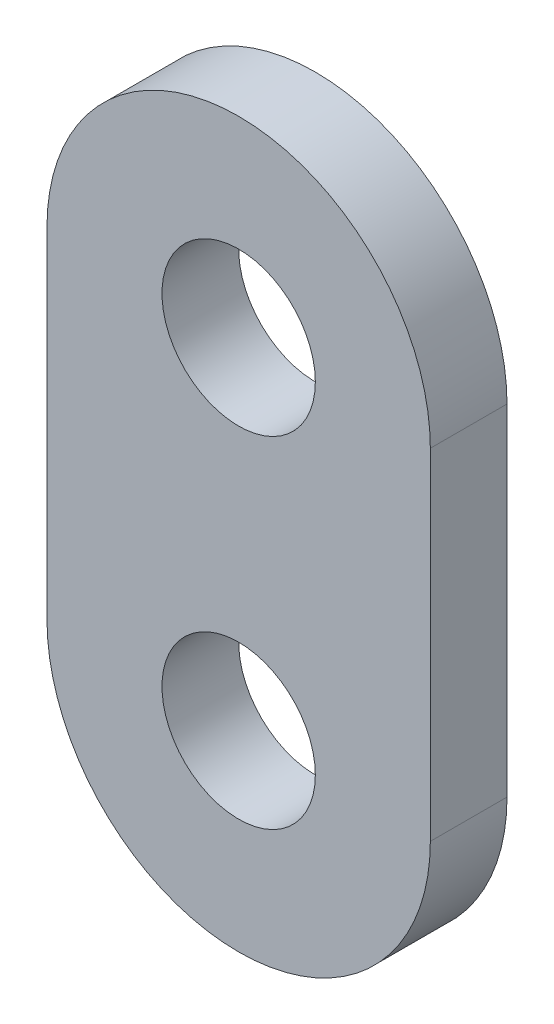
ISO-10303-21;
HEADER;
FILE_DESCRIPTION(('STEP AP214'),'2;1');
FILE_NAME('part.step','',(''),(''),'','','');
FILE_SCHEMA(('AUTOMOTIVE_DESIGN { 1 0 10303 214 1 1 1 1 }'));
ENDSEC;
DATA;
#1=APPLICATION_CONTEXT('core data for automotive mechanical design processes');
#2=APPLICATION_PROTOCOL_DEFINITION('international standard','automotive_design',2000,#1);
#3=PRODUCT_CONTEXT('',#1,'mechanical');
#4=PRODUCT('Part','Part','',(#3));
#5=PRODUCT_RELATED_PRODUCT_CATEGORY('part','',(#4));
#6=PRODUCT_DEFINITION_FORMATION('','',#4);
#7=PRODUCT_DEFINITION_CONTEXT('part definition',#1,'design');
#8=PRODUCT_DEFINITION('design','',#6,#7);
#9=PRODUCT_DEFINITION_SHAPE('','',#8);
#10=(LENGTH_UNIT() NAMED_UNIT(*) SI_UNIT(.MILLI.,.METRE.));
#11=(NAMED_UNIT(*) PLANE_ANGLE_UNIT() SI_UNIT($,.RADIAN.));
#12=(NAMED_UNIT(*) SI_UNIT($,.STERADIAN.) SOLID_ANGLE_UNIT());
#13=UNCERTAINTY_MEASURE_WITH_UNIT(LENGTH_MEASURE(1.E-05),#10,'distance_accuracy_value','');
#14=(GEOMETRIC_REPRESENTATION_CONTEXT(3) GLOBAL_UNCERTAINTY_ASSIGNED_CONTEXT((#13)) GLOBAL_UNIT_ASSIGNED_CONTEXT((#10,
#11,#12)) REPRESENTATION_CONTEXT('',''));
#15=CARTESIAN_POINT('',(0.,0.,0.));
#16=DIRECTION('',(0.,0.,1.));
#17=DIRECTION('',(1.,0.,0.));
#18=AXIS2_PLACEMENT_3D('',#15,#16,#17);
#19=CARTESIAN_POINT('',(25.,0.,10.));
#20=DIRECTION('',(0.,0.,1.));
#21=DIRECTION('',(1.,0.,0.));
#22=AXIS2_PLACEMENT_3D('',#19,#20,#21);
#23=PLANE('',#22);
#24=CARTESIAN_POINT('',(25.,44.4,10.));
#25=DIRECTION('',(0.,0.,1.));
#26=DIRECTION('',(1.,0.,0.));
#27=AXIS2_PLACEMENT_3D('',#24,#25,#26);
#28=CIRCLE('',#27,10.);
#29=CARTESIAN_POINT('',(35.,44.4,10.));
#30=VERTEX_POINT('',#29);
#31=EDGE_CURVE('E100',#30,#30,#28,.T.);
#32=ORIENTED_EDGE('',*,*,#31,.F.);
#33=EDGE_LOOP('',(#32));
#34=FACE_BOUND('',#33,.T.);
#35=CARTESIAN_POINT('',(25.,0.,10.));
#36=DIRECTION('',(0.,0.,1.));
#37=DIRECTION('',(1.,0.,0.));
#38=AXIS2_PLACEMENT_3D('',#35,#36,#37);
#39=CIRCLE('',#38,25.);
#40=CARTESIAN_POINT('',(0.,0.,10.));
#41=VERTEX_POINT('',#40);
#42=CARTESIAN_POINT('',(50.,0.,10.));
#43=VERTEX_POINT('',#42);
#44=EDGE_CURVE('E85',#41,#43,#39,.T.);
#45=ORIENTED_EDGE('',*,*,#44,.T.);
#46=DIRECTION('',(0.,1.,0.));
#47=VECTOR('',#46,1.);
#48=CARTESIAN_POINT('',(50.,0.,10.));
#49=LINE('',#48,#47);
#50=CARTESIAN_POINT('',(50.,44.4,10.));
#51=VERTEX_POINT('',#50);
#52=EDGE_CURVE('E80',#43,#51,#49,.T.);
#53=ORIENTED_EDGE('',*,*,#52,.T.);
#54=CARTESIAN_POINT('',(25.,44.4,10.));
#55=DIRECTION('',(0.,0.,1.));
#56=DIRECTION('',(1.,0.,0.));
#57=AXIS2_PLACEMENT_3D('',#54,#55,#56);
#58=CIRCLE('',#57,25.);
#59=CARTESIAN_POINT('',(0.,44.4,10.));
#60=VERTEX_POINT('',#59);
#61=EDGE_CURVE('E83',#51,#60,#58,.T.);
#62=ORIENTED_EDGE('',*,*,#61,.T.);
#63=DIRECTION('',(0.,-1.,0.));
#64=VECTOR('',#63,1.);
#65=CARTESIAN_POINT('',(0.,44.4,10.));
#66=LINE('',#65,#64);
#67=EDGE_CURVE('E50',#60,#41,#66,.T.);
#68=ORIENTED_EDGE('',*,*,#67,.T.);
#69=EDGE_LOOP('',(#45,#53,#62,#68));
#70=FACE_BOUND('',#69,.T.);
#71=CARTESIAN_POINT('',(25.,0.,10.));
#72=DIRECTION('',(0.,0.,1.));
#73=DIRECTION('',(1.,0.,0.));
#74=AXIS2_PLACEMENT_3D('',#71,#72,#73);
#75=CIRCLE('',#74,10.);
#76=CARTESIAN_POINT('',(35.,0.,10.));
#77=VERTEX_POINT('',#76);
#78=EDGE_CURVE('E115',#77,#77,#75,.T.);
#79=ORIENTED_EDGE('',*,*,#78,.F.);
#80=EDGE_LOOP('',(#79));
#81=FACE_BOUND('',#80,.T.);
#82=ADVANCED_FACE('F33',(#34,#70,#81),#23,.T.);
#83=CARTESIAN_POINT('',(25.,0.,0.));
#84=DIRECTION('',(0.,0.,1.));
#85=DIRECTION('',(1.,0.,0.));
#86=AXIS2_PLACEMENT_3D('',#83,#84,#85);
#87=PLANE('',#86);
#88=CARTESIAN_POINT('',(25.,44.4,0.));
#89=DIRECTION('',(0.,0.,1.));
#90=DIRECTION('',(1.,0.,0.));
#91=AXIS2_PLACEMENT_3D('',#88,#89,#90);
#92=CIRCLE('',#91,10.);
#93=CARTESIAN_POINT('',(35.,44.4,0.));
#94=VERTEX_POINT('',#93);
#95=EDGE_CURVE('E112',#94,#94,#92,.T.);
#96=ORIENTED_EDGE('',*,*,#95,.T.);
#97=EDGE_LOOP('',(#96));
#98=FACE_BOUND('',#97,.T.);
#99=CARTESIAN_POINT('',(25.,0.,0.));
#100=DIRECTION('',(0.,0.,1.));
#101=DIRECTION('',(1.,0.,0.));
#102=AXIS2_PLACEMENT_3D('',#99,#100,#101);
#103=CIRCLE('',#102,25.);
#104=CARTESIAN_POINT('',(0.,0.,0.));
#105=VERTEX_POINT('',#104);
#106=CARTESIAN_POINT('',(50.,0.,0.));
#107=VERTEX_POINT('',#106);
#108=EDGE_CURVE('E97',#105,#107,#103,.T.);
#109=ORIENTED_EDGE('',*,*,#108,.F.);
#110=DIRECTION('',(0.,-1.,0.));
#111=VECTOR('',#110,1.);
#112=CARTESIAN_POINT('',(0.,44.4,0.));
#113=LINE('',#112,#111);
#114=CARTESIAN_POINT('',(0.,44.4,0.));
#115=VERTEX_POINT('',#114);
#116=EDGE_CURVE('E73',#115,#105,#113,.T.);
#117=ORIENTED_EDGE('',*,*,#116,.F.);
#118=CARTESIAN_POINT('',(25.,44.4,0.));
#119=DIRECTION('',(0.,0.,1.));
#120=DIRECTION('',(1.,0.,0.));
#121=AXIS2_PLACEMENT_3D('',#118,#119,#120);
#122=CIRCLE('',#121,25.);
#123=CARTESIAN_POINT('',(50.,44.4,0.));
#124=VERTEX_POINT('',#123);
#125=EDGE_CURVE('E67',#124,#115,#122,.T.);
#126=ORIENTED_EDGE('',*,*,#125,.F.);
#127=DIRECTION('',(0.,1.,0.));
#128=VECTOR('',#127,1.);
#129=CARTESIAN_POINT('',(50.,0.,0.));
#130=LINE('',#129,#128);
#131=EDGE_CURVE('E89',#107,#124,#130,.T.);
#132=ORIENTED_EDGE('',*,*,#131,.F.);
#133=EDGE_LOOP('',(#109,#117,#126,#132));
#134=FACE_BOUND('',#133,.T.);
#135=CARTESIAN_POINT('',(25.,0.,0.));
#136=DIRECTION('',(0.,0.,1.));
#137=DIRECTION('',(1.,0.,0.));
#138=AXIS2_PLACEMENT_3D('',#135,#136,#137);
#139=CIRCLE('',#138,10.);
#140=CARTESIAN_POINT('',(35.,0.,0.));
#141=VERTEX_POINT('',#140);
#142=EDGE_CURVE('E118',#141,#141,#139,.T.);
#143=ORIENTED_EDGE('',*,*,#142,.T.);
#144=EDGE_LOOP('',(#143));
#145=FACE_BOUND('',#144,.T.);
#146=ADVANCED_FACE('F108',(#98,#134,#145),#87,.F.);
#147=CARTESIAN_POINT('',(25.,0.,10.));
#148=DIRECTION('',(0.,0.,-1.));
#149=DIRECTION('',(-1.,0.,0.));
#150=AXIS2_PLACEMENT_3D('',#147,#148,#149);
#151=CYLINDRICAL_SURFACE('',#150,25.);
#152=ORIENTED_EDGE('',*,*,#108,.T.);
#153=DIRECTION('',(0.,0.,-1.));
#154=VECTOR('',#153,1.);
#155=CARTESIAN_POINT('',(50.,0.,10.));
#156=LINE('',#155,#154);
#157=EDGE_CURVE('E11',#43,#107,#156,.T.);
#158=ORIENTED_EDGE('',*,*,#157,.F.);
#159=ORIENTED_EDGE('',*,*,#44,.F.);
#160=DIRECTION('',(0.,0.,-1.));
#161=VECTOR('',#160,1.);
#162=CARTESIAN_POINT('',(0.,0.,10.));
#163=LINE('',#162,#161);
#164=EDGE_CURVE('E93',#41,#105,#163,.T.);
#165=ORIENTED_EDGE('',*,*,#164,.T.);
#166=EDGE_LOOP('',(#152,#158,#159,#165));
#167=FACE_BOUND('',#166,.T.);
#168=ADVANCED_FACE('F35',(#167),#151,.T.);
#169=CARTESIAN_POINT('',(50.,0.,10.));
#170=DIRECTION('',(-1.,0.,0.));
#171=DIRECTION('',(0.,-1.,0.));
#172=AXIS2_PLACEMENT_3D('',#169,#170,#171);
#173=PLANE('',#172);
#174=ORIENTED_EDGE('',*,*,#131,.T.);
#175=DIRECTION('',(0.,0.,-1.));
#176=VECTOR('',#175,1.);
#177=CARTESIAN_POINT('',(50.,44.4,10.));
#178=LINE('',#177,#176);
#179=EDGE_CURVE('E42',#51,#124,#178,.T.);
#180=ORIENTED_EDGE('',*,*,#179,.F.);
#181=ORIENTED_EDGE('',*,*,#52,.F.);
#182=ORIENTED_EDGE('',*,*,#157,.T.);
#183=EDGE_LOOP('',(#174,#180,#181,#182));
#184=FACE_BOUND('',#183,.T.);
#185=ADVANCED_FACE('F88',(#184),#173,.F.);
#186=CARTESIAN_POINT('',(25.,44.4,10.));
#187=DIRECTION('',(0.,0.,-1.));
#188=DIRECTION('',(-1.,0.,0.));
#189=AXIS2_PLACEMENT_3D('',#186,#187,#188);
#190=CYLINDRICAL_SURFACE('',#189,25.);
#191=ORIENTED_EDGE('',*,*,#125,.T.);
#192=DIRECTION('',(0.,0.,-1.));
#193=VECTOR('',#192,1.);
#194=CARTESIAN_POINT('',(0.,44.4,10.));
#195=LINE('',#194,#193);
#196=EDGE_CURVE('E90',#60,#115,#195,.T.);
#197=ORIENTED_EDGE('',*,*,#196,.F.);
#198=ORIENTED_EDGE('',*,*,#61,.F.);
#199=ORIENTED_EDGE('',*,*,#179,.T.);
#200=EDGE_LOOP('',(#191,#197,#198,#199));
#201=FACE_BOUND('',#200,.T.);
#202=ADVANCED_FACE('F91',(#201),#190,.T.);
#203=CARTESIAN_POINT('',(0.,44.4,10.));
#204=DIRECTION('',(1.,0.,0.));
#205=DIRECTION('',(0.,1.,0.));
#206=AXIS2_PLACEMENT_3D('',#203,#204,#205);
#207=PLANE('',#206);
#208=ORIENTED_EDGE('',*,*,#116,.T.);
#209=ORIENTED_EDGE('',*,*,#164,.F.);
#210=ORIENTED_EDGE('',*,*,#67,.F.);
#211=ORIENTED_EDGE('',*,*,#196,.T.);
#212=EDGE_LOOP('',(#208,#209,#210,#211));
#213=FACE_BOUND('',#212,.T.);
#214=ADVANCED_FACE('F105',(#213),#207,.F.);
#215=CARTESIAN_POINT('',(25.,44.4,10.));
#216=DIRECTION('',(0.,0.,-1.));
#217=DIRECTION('',(-1.,0.,0.));
#218=AXIS2_PLACEMENT_3D('',#215,#216,#217);
#219=CYLINDRICAL_SURFACE('',#218,10.);
#220=ORIENTED_EDGE('',*,*,#31,.T.);
#221=EDGE_LOOP('',(#220));
#222=FACE_BOUND('',#221,.T.);
#223=ORIENTED_EDGE('',*,*,#95,.F.);
#224=EDGE_LOOP('',(#223));
#225=FACE_BOUND('',#224,.T.);
#226=ADVANCED_FACE('F136',(#222,#225),#219,.F.);
#227=CARTESIAN_POINT('',(25.,0.,10.));
#228=DIRECTION('',(0.,0.,-1.));
#229=DIRECTION('',(-1.,0.,0.));
#230=AXIS2_PLACEMENT_3D('',#227,#228,#229);
#231=CYLINDRICAL_SURFACE('',#230,10.);
#232=ORIENTED_EDGE('',*,*,#78,.T.);
#233=EDGE_LOOP('',(#232));
#234=FACE_BOUND('',#233,.T.);
#235=ORIENTED_EDGE('',*,*,#142,.F.);
#236=EDGE_LOOP('',(#235));
#237=FACE_BOUND('',#236,.T.);
#238=ADVANCED_FACE('F124',(#234,#237),#231,.F.);
#239=CLOSED_SHELL('',(#82,#146,#168,#185,#202,#214,#226,#238));
#240=MANIFOLD_SOLID_BREP('B2',#239);
#241=ADVANCED_BREP_SHAPE_REPRESENTATION('',(#18,#240),#14);
#242=SHAPE_DEFINITION_REPRESENTATION(#9,#241);
ENDSEC;
END-ISO-10303-21;
